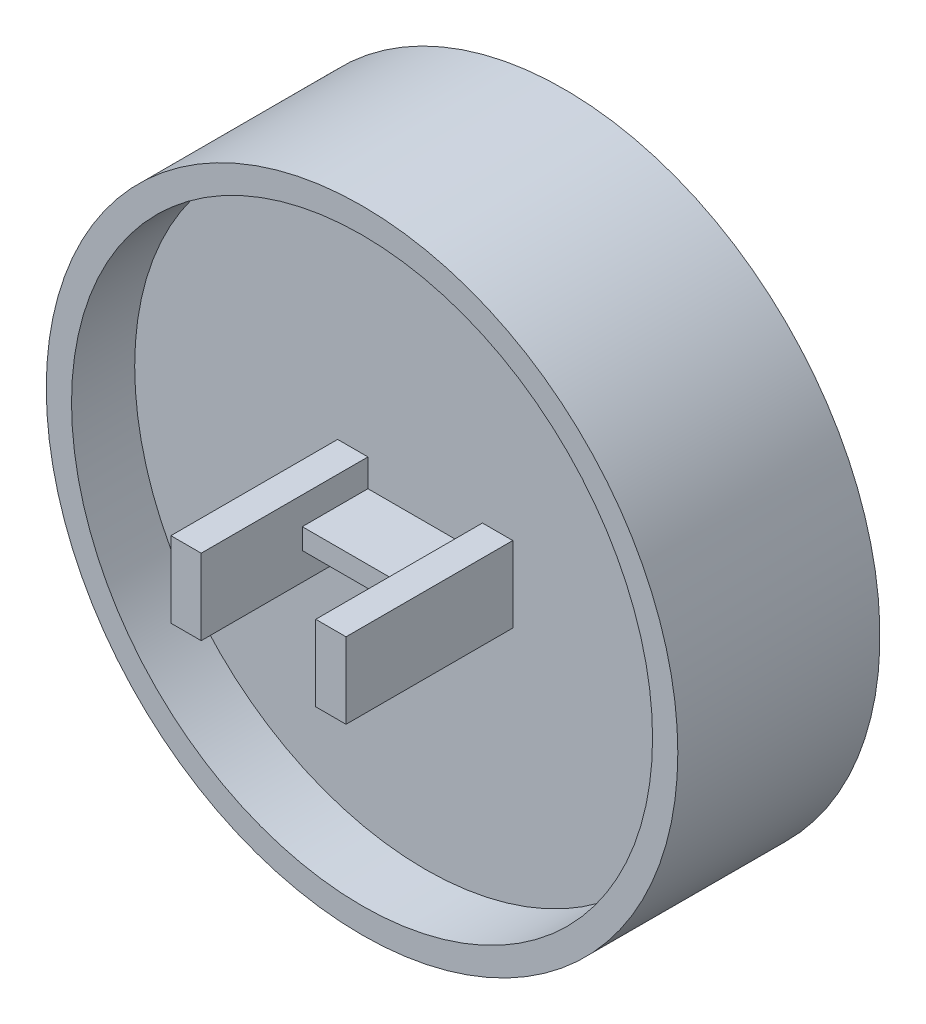
ISO-10303-21;
HEADER;
FILE_DESCRIPTION(('STEP AP214'),'2;1');
FILE_NAME('part.step','',(''),(''),'','','');
FILE_SCHEMA(('AUTOMOTIVE_DESIGN { 1 0 10303 214 1 1 1 1 }'));
ENDSEC;
DATA;
#1=APPLICATION_CONTEXT('core data for automotive mechanical design processes');
#2=APPLICATION_PROTOCOL_DEFINITION('international standard','automotive_design',2000,#1);
#3=PRODUCT_CONTEXT('',#1,'mechanical');
#4=PRODUCT('Part','Part','',(#3));
#5=PRODUCT_RELATED_PRODUCT_CATEGORY('part','',(#4));
#6=PRODUCT_DEFINITION_FORMATION('','',#4);
#7=PRODUCT_DEFINITION_CONTEXT('part definition',#1,'design');
#8=PRODUCT_DEFINITION('design','',#6,#7);
#9=PRODUCT_DEFINITION_SHAPE('','',#8);
#10=(LENGTH_UNIT() NAMED_UNIT(*) SI_UNIT(.MILLI.,.METRE.));
#11=(NAMED_UNIT(*) PLANE_ANGLE_UNIT() SI_UNIT($,.RADIAN.));
#12=(NAMED_UNIT(*) SI_UNIT($,.STERADIAN.) SOLID_ANGLE_UNIT());
#13=UNCERTAINTY_MEASURE_WITH_UNIT(LENGTH_MEASURE(1.E-05),#10,'distance_accuracy_value','');
#14=(GEOMETRIC_REPRESENTATION_CONTEXT(3) GLOBAL_UNCERTAINTY_ASSIGNED_CONTEXT((#13)) GLOBAL_UNIT_ASSIGNED_CONTEXT((#10,
#11,#12)) REPRESENTATION_CONTEXT('',''));
#15=CARTESIAN_POINT('',(0.,0.,0.));
#16=DIRECTION('',(0.,0.,1.));
#17=DIRECTION('',(1.,0.,0.));
#18=AXIS2_PLACEMENT_3D('',#15,#16,#17);
#19=CARTESIAN_POINT('',(0.,0.,5.1));
#20=DIRECTION('',(0.,0.,-1.));
#21=DIRECTION('',(-1.,0.,0.));
#22=AXIS2_PLACEMENT_3D('',#19,#20,#21);
#23=PLANE('',#22);
#24=DIRECTION('',(0.,-1.,0.));
#25=VECTOR('',#24,1.);
#26=CARTESIAN_POINT('',(2.2665,1.50603443882752,5.1));
#27=LINE('',#26,#25);
#28=CARTESIAN_POINT('',(2.2665,0.415113024771375,5.1));
#29=VERTEX_POINT('',#28);
#30=CARTESIAN_POINT('',(2.2665,-0.403044147116343,5.1));
#31=VERTEX_POINT('',#30);
#32=EDGE_CURVE('E160',#29,#31,#27,.T.);
#33=ORIENTED_EDGE('',*,*,#32,.F.);
#34=DIRECTION('',(-1.,0.,0.));
#35=VECTOR('',#34,1.);
#36=CARTESIAN_POINT('',(-2.2665,0.415113024771375,5.1));
#37=LINE('',#36,#35);
#38=CARTESIAN_POINT('',(-2.2665,0.415113024771375,5.1));
#39=VERTEX_POINT('',#38);
#40=EDGE_CURVE('E65',#29,#39,#37,.T.);
#41=ORIENTED_EDGE('',*,*,#40,.T.);
#42=DIRECTION('',(0.,1.,0.));
#43=VECTOR('',#42,1.);
#44=CARTESIAN_POINT('',(-2.2665,1.50603443882752,5.1));
#45=LINE('',#44,#43);
#46=CARTESIAN_POINT('',(-2.2665,-0.403044147116343,5.1));
#47=VERTEX_POINT('',#46);
#48=EDGE_CURVE('E11',#47,#39,#45,.T.);
#49=ORIENTED_EDGE('',*,*,#48,.F.);
#50=DIRECTION('',(1.,0.,0.));
#51=VECTOR('',#50,1.);
#52=CARTESIAN_POINT('',(-2.2665,-0.403044147116343,5.1));
#53=LINE('',#52,#51);
#54=EDGE_CURVE('E181',#47,#31,#53,.T.);
#55=ORIENTED_EDGE('',*,*,#54,.T.);
#56=EDGE_LOOP('',(#33,#41,#49,#55));
#57=FACE_BOUND('',#56,.T.);
#58=ADVANCED_FACE('F40',(#57),#23,.F.);
#59=CARTESIAN_POINT('',(0.,0.,2.5));
#60=DIRECTION('',(0.,0.,1.));
#61=DIRECTION('',(1.,0.,0.));
#62=AXIS2_PLACEMENT_3D('',#59,#60,#61);
#63=PLANE('',#62);
#64=CARTESIAN_POINT('',(0.,0.,2.5));
#65=DIRECTION('',(0.,0.,1.));
#66=DIRECTION('',(1.,0.,0.));
#67=AXIS2_PLACEMENT_3D('',#64,#65,#66);
#68=CIRCLE('',#67,11.5);
#69=CARTESIAN_POINT('',(11.5,0.,2.5));
#70=VERTEX_POINT('',#69);
#71=EDGE_CURVE('E232',#70,#70,#68,.T.);
#72=ORIENTED_EDGE('',*,*,#71,.T.);
#73=EDGE_LOOP('',(#72));
#74=FACE_BOUND('',#73,.T.);
#75=DIRECTION('',(0.,1.,0.));
#76=VECTOR('',#75,1.);
#77=CARTESIAN_POINT('',(-2.2665,-0.403044147116343,2.5));
#78=LINE('',#77,#76);
#79=CARTESIAN_POINT('',(-2.2665,-1.49396556117248,2.5));
#80=VERTEX_POINT('',#79);
#81=CARTESIAN_POINT('',(-2.2665,-0.403044147116343,2.5));
#82=VERTEX_POINT('',#81);
#83=EDGE_CURVE('E187',#80,#82,#78,.T.);
#84=ORIENTED_EDGE('',*,*,#83,.F.);
#85=DIRECTION('',(1.,0.,0.));
#86=VECTOR('',#85,1.);
#87=CARTESIAN_POINT('',(-3.4665,-1.49396556117248,2.5));
#88=LINE('',#87,#86);
#89=CARTESIAN_POINT('',(-3.4665,-1.49396556117248,2.5));
#90=VERTEX_POINT('',#89);
#91=EDGE_CURVE('E179',#90,#80,#88,.T.);
#92=ORIENTED_EDGE('',*,*,#91,.F.);
#93=DIRECTION('',(0.,-1.,0.));
#94=VECTOR('',#93,1.);
#95=CARTESIAN_POINT('',(-3.4665,1.50603443882752,2.5));
#96=LINE('',#95,#94);
#97=CARTESIAN_POINT('',(-3.4665,1.50603443882752,2.5));
#98=VERTEX_POINT('',#97);
#99=EDGE_CURVE('E105',#98,#90,#96,.T.);
#100=ORIENTED_EDGE('',*,*,#99,.F.);
#101=DIRECTION('',(-1.,0.,0.));
#102=VECTOR('',#101,1.);
#103=CARTESIAN_POINT('',(-3.4665,1.50603443882752,2.5));
#104=LINE('',#103,#102);
#105=CARTESIAN_POINT('',(-2.2665,1.50603443882752,2.5));
#106=VERTEX_POINT('',#105);
#107=EDGE_CURVE('E204',#106,#98,#104,.T.);
#108=ORIENTED_EDGE('',*,*,#107,.F.);
#109=DIRECTION('',(0.,1.,0.));
#110=VECTOR('',#109,1.);
#111=CARTESIAN_POINT('',(-2.2665,1.50603443882752,2.5));
#112=LINE('',#111,#110);
#113=CARTESIAN_POINT('',(-2.2665,0.415113024771375,2.5));
#114=VERTEX_POINT('',#113);
#115=EDGE_CURVE('E202',#114,#106,#112,.T.);
#116=ORIENTED_EDGE('',*,*,#115,.F.);
#117=DIRECTION('',(-1.,0.,0.));
#118=VECTOR('',#117,1.);
#119=CARTESIAN_POINT('',(-2.2665,0.415113024771375,2.5));
#120=LINE('',#119,#118);
#121=CARTESIAN_POINT('',(2.2665,0.415113024771375,2.5));
#122=VERTEX_POINT('',#121);
#123=EDGE_CURVE('E200',#122,#114,#120,.T.);
#124=ORIENTED_EDGE('',*,*,#123,.F.);
#125=DIRECTION('',(0.,-1.,0.));
#126=VECTOR('',#125,1.);
#127=CARTESIAN_POINT('',(2.2665,0.415113024771375,2.5));
#128=LINE('',#127,#126);
#129=CARTESIAN_POINT('',(2.2665,1.50603443882752,2.5));
#130=VERTEX_POINT('',#129);
#131=EDGE_CURVE('E198',#130,#122,#128,.T.);
#132=ORIENTED_EDGE('',*,*,#131,.F.);
#133=DIRECTION('',(-1.,0.,0.));
#134=VECTOR('',#133,1.);
#135=CARTESIAN_POINT('',(3.4665,1.50603443882752,2.5));
#136=LINE('',#135,#134);
#137=CARTESIAN_POINT('',(3.4665,1.50603443882752,2.5));
#138=VERTEX_POINT('',#137);
#139=EDGE_CURVE('E196',#138,#130,#136,.T.);
#140=ORIENTED_EDGE('',*,*,#139,.F.);
#141=DIRECTION('',(0.,1.,0.));
#142=VECTOR('',#141,1.);
#143=CARTESIAN_POINT('',(3.4665,1.50603443882752,2.5));
#144=LINE('',#143,#142);
#145=CARTESIAN_POINT('',(3.4665,-1.49396556117248,2.5));
#146=VERTEX_POINT('',#145);
#147=EDGE_CURVE('E140',#146,#138,#144,.T.);
#148=ORIENTED_EDGE('',*,*,#147,.F.);
#149=DIRECTION('',(1.,0.,0.));
#150=VECTOR('',#149,1.);
#151=CARTESIAN_POINT('',(3.4665,-1.49396556117248,2.5));
#152=LINE('',#151,#150);
#153=CARTESIAN_POINT('',(2.2665,-1.49396556117248,2.5));
#154=VERTEX_POINT('',#153);
#155=EDGE_CURVE('E193',#154,#146,#152,.T.);
#156=ORIENTED_EDGE('',*,*,#155,.F.);
#157=DIRECTION('',(0.,-1.,0.));
#158=VECTOR('',#157,1.);
#159=CARTESIAN_POINT('',(2.2665,-0.403044147116343,2.5));
#160=LINE('',#159,#158);
#161=CARTESIAN_POINT('',(2.2665,-0.403044147116343,2.5));
#162=VERTEX_POINT('',#161);
#163=EDGE_CURVE('E191',#162,#154,#160,.T.);
#164=ORIENTED_EDGE('',*,*,#163,.F.);
#165=DIRECTION('',(1.,0.,0.));
#166=VECTOR('',#165,1.);
#167=CARTESIAN_POINT('',(-2.2665,-0.403044147116343,2.5));
#168=LINE('',#167,#166);
#169=EDGE_CURVE('E189',#82,#162,#168,.T.);
#170=ORIENTED_EDGE('',*,*,#169,.F.);
#171=EDGE_LOOP('',(#84,#92,#100,#108,#116,#124,#132,#140,#148,#156,#164,#170));
#172=FACE_BOUND('',#171,.T.);
#173=ADVANCED_FACE('F247',(#74,#172),#63,.T.);
#174=CARTESIAN_POINT('',(0.,0.,5.));
#175=DIRECTION('',(0.,0.,-1.));
#176=DIRECTION('',(-1.,0.,0.));
#177=AXIS2_PLACEMENT_3D('',#174,#175,#176);
#178=CYLINDRICAL_SURFACE('',#177,12.5);
#179=CARTESIAN_POINT('',(0.,0.,5.));
#180=DIRECTION('',(0.,0.,1.));
#181=DIRECTION('',(1.,0.,0.));
#182=AXIS2_PLACEMENT_3D('',#179,#180,#181);
#183=CIRCLE('',#182,12.5);
#184=CARTESIAN_POINT('',(12.5,0.,5.));
#185=VERTEX_POINT('',#184);
#186=EDGE_CURVE('E44',#185,#185,#183,.T.);
#187=ORIENTED_EDGE('',*,*,#186,.F.);
#188=EDGE_LOOP('',(#187));
#189=FACE_BOUND('',#188,.T.);
#190=CARTESIAN_POINT('',(0.,0.,-3.));
#191=DIRECTION('',(0.,0.,-1.));
#192=DIRECTION('',(-1.,0.,0.));
#193=AXIS2_PLACEMENT_3D('',#190,#191,#192);
#194=CIRCLE('',#193,12.5);
#195=CARTESIAN_POINT('',(-12.5,0.,-3.));
#196=VERTEX_POINT('',#195);
#197=EDGE_CURVE('E155',#196,#196,#194,.T.);
#198=ORIENTED_EDGE('',*,*,#197,.F.);
#199=EDGE_LOOP('',(#198));
#200=FACE_BOUND('',#199,.T.);
#201=ADVANCED_FACE('F42',(#189,#200),#178,.T.);
#202=CARTESIAN_POINT('',(0.,0.,5.));
#203=DIRECTION('',(0.,0.,1.));
#204=DIRECTION('',(1.,0.,0.));
#205=AXIS2_PLACEMENT_3D('',#202,#203,#204);
#206=PLANE('',#205);
#207=CARTESIAN_POINT('',(0.,0.,5.));
#208=DIRECTION('',(0.,0.,1.));
#209=DIRECTION('',(1.,0.,0.));
#210=AXIS2_PLACEMENT_3D('',#207,#208,#209);
#211=CIRCLE('',#210,11.5);
#212=CARTESIAN_POINT('',(11.5,0.,5.));
#213=VERTEX_POINT('',#212);
#214=EDGE_CURVE('E231',#213,#213,#211,.T.);
#215=ORIENTED_EDGE('',*,*,#214,.F.);
#216=EDGE_LOOP('',(#215));
#217=FACE_BOUND('',#216,.T.);
#218=ORIENTED_EDGE('',*,*,#186,.T.);
#219=EDGE_LOOP('',(#218));
#220=FACE_BOUND('',#219,.T.);
#221=ADVANCED_FACE('F239',(#217,#220),#206,.T.);
#222=CARTESIAN_POINT('',(0.,0.,2.5));
#223=DIRECTION('',(0.,0.,1.));
#224=DIRECTION('',(1.,0.,0.));
#225=AXIS2_PLACEMENT_3D('',#222,#223,#224);
#226=CYLINDRICAL_SURFACE('',#225,11.5);
#227=ORIENTED_EDGE('',*,*,#71,.F.);
#228=EDGE_LOOP('',(#227));
#229=FACE_BOUND('',#228,.T.);
#230=ORIENTED_EDGE('',*,*,#214,.T.);
#231=EDGE_LOOP('',(#230));
#232=FACE_BOUND('',#231,.T.);
#233=ADVANCED_FACE('F237',(#229,#232),#226,.F.);
#234=CARTESIAN_POINT('',(-3.4665,-1.49396556117248,5.1));
#235=DIRECTION('',(0.,1.,0.));
#236=DIRECTION('',(0.,0.,1.));
#237=AXIS2_PLACEMENT_3D('',#234,#235,#236);
#238=PLANE('',#237);
#239=ORIENTED_EDGE('',*,*,#91,.T.);
#240=DIRECTION('',(0.,0.,-1.));
#241=VECTOR('',#240,1.);
#242=CARTESIAN_POINT('',(-2.2665,-1.49396556117248,5.1));
#243=LINE('',#242,#241);
#244=CARTESIAN_POINT('',(-2.2665,-1.49396556117248,9.1));
#245=VERTEX_POINT('',#244);
#246=EDGE_CURVE('E229',#245,#80,#243,.T.);
#247=ORIENTED_EDGE('',*,*,#246,.F.);
#248=DIRECTION('',(1.,0.,0.));
#249=VECTOR('',#248,1.);
#250=CARTESIAN_POINT('',(-2.2665,-1.49396556117248,9.1));
#251=LINE('',#250,#249);
#252=CARTESIAN_POINT('',(-3.4665,-1.49396556117248,9.1));
#253=VERTEX_POINT('',#252);
#254=EDGE_CURVE('E174',#253,#245,#251,.T.);
#255=ORIENTED_EDGE('',*,*,#254,.F.);
#256=DIRECTION('',(0.,0.,-1.));
#257=VECTOR('',#256,1.);
#258=CARTESIAN_POINT('',(-3.4665,-1.49396556117248,5.1));
#259=LINE('',#258,#257);
#260=EDGE_CURVE('E184',#253,#90,#259,.T.);
#261=ORIENTED_EDGE('',*,*,#260,.T.);
#262=EDGE_LOOP('',(#239,#247,#255,#261));
#263=FACE_BOUND('',#262,.T.);
#264=ADVANCED_FACE('F299',(#263),#238,.F.);
#265=CARTESIAN_POINT('',(-2.2665,-0.403044147116343,5.1));
#266=DIRECTION('',(-1.,0.,0.));
#267=DIRECTION('',(0.,0.,1.));
#268=AXIS2_PLACEMENT_3D('',#265,#266,#267);
#269=PLANE('',#268);
#270=ORIENTED_EDGE('',*,*,#83,.T.);
#271=DIRECTION('',(0.,0.,-1.));
#272=VECTOR('',#271,1.);
#273=CARTESIAN_POINT('',(-2.2665,-0.403044147116343,5.1));
#274=LINE('',#273,#272);
#275=EDGE_CURVE('E226',#47,#82,#274,.T.);
#276=ORIENTED_EDGE('',*,*,#275,.F.);
#277=ORIENTED_EDGE('',*,*,#48,.T.);
#278=DIRECTION('',(0.,0.,-1.));
#279=VECTOR('',#278,1.);
#280=CARTESIAN_POINT('',(-2.2665,0.415113024771375,5.1));
#281=LINE('',#280,#279);
#282=EDGE_CURVE('E212',#39,#114,#281,.T.);
#283=ORIENTED_EDGE('',*,*,#282,.T.);
#284=ORIENTED_EDGE('',*,*,#115,.T.);
#285=DIRECTION('',(0.,0.,-1.));
#286=VECTOR('',#285,1.);
#287=CARTESIAN_POINT('',(-2.2665,1.50603443882752,5.1));
#288=LINE('',#287,#286);
#289=CARTESIAN_POINT('',(-2.2665,1.50603443882752,9.1));
#290=VERTEX_POINT('',#289);
#291=EDGE_CURVE('E209',#290,#106,#288,.T.);
#292=ORIENTED_EDGE('',*,*,#291,.F.);
#293=DIRECTION('',(0.,1.,0.));
#294=VECTOR('',#293,1.);
#295=CARTESIAN_POINT('',(-2.2665,1.50603443882752,9.1));
#296=LINE('',#295,#294);
#297=EDGE_CURVE('E177',#245,#290,#296,.T.);
#298=ORIENTED_EDGE('',*,*,#297,.F.);
#299=ORIENTED_EDGE('',*,*,#246,.T.);
#300=EDGE_LOOP('',(#270,#276,#277,#283,#284,#292,#298,#299));
#301=FACE_BOUND('',#300,.T.);
#302=ADVANCED_FACE('F295',(#301),#269,.F.);
#303=CARTESIAN_POINT('',(-2.2665,-0.403044147116343,5.1));
#304=DIRECTION('',(0.,1.,0.));
#305=DIRECTION('',(0.,0.,1.));
#306=AXIS2_PLACEMENT_3D('',#303,#304,#305);
#307=PLANE('',#306);
#308=ORIENTED_EDGE('',*,*,#169,.T.);
#309=DIRECTION('',(0.,0.,-1.));
#310=VECTOR('',#309,1.);
#311=CARTESIAN_POINT('',(2.2665,-0.403044147116343,5.1));
#312=LINE('',#311,#310);
#313=EDGE_CURVE('E223',#31,#162,#312,.T.);
#314=ORIENTED_EDGE('',*,*,#313,.F.);
#315=ORIENTED_EDGE('',*,*,#54,.F.);
#316=ORIENTED_EDGE('',*,*,#275,.T.);
#317=EDGE_LOOP('',(#308,#314,#315,#316));
#318=FACE_BOUND('',#317,.T.);
#319=ADVANCED_FACE('F291',(#318),#307,.F.);
#320=CARTESIAN_POINT('',(2.2665,-0.403044147116343,5.1));
#321=DIRECTION('',(1.,0.,0.));
#322=DIRECTION('',(0.,0.,-1.));
#323=AXIS2_PLACEMENT_3D('',#320,#321,#322);
#324=PLANE('',#323);
#325=ORIENTED_EDGE('',*,*,#163,.T.);
#326=DIRECTION('',(0.,0.,-1.));
#327=VECTOR('',#326,1.);
#328=CARTESIAN_POINT('',(2.2665,-1.49396556117248,5.1));
#329=LINE('',#328,#327);
#330=CARTESIAN_POINT('',(2.2665,-1.49396556117248,9.1));
#331=VERTEX_POINT('',#330);
#332=EDGE_CURVE('E220',#331,#154,#329,.T.);
#333=ORIENTED_EDGE('',*,*,#332,.F.);
#334=DIRECTION('',(0.,-1.,0.));
#335=VECTOR('',#334,1.);
#336=CARTESIAN_POINT('',(2.2665,1.50603443882752,9.1));
#337=LINE('',#336,#335);
#338=CARTESIAN_POINT('',(2.2665,1.50603443882752,9.1));
#339=VERTEX_POINT('',#338);
#340=EDGE_CURVE('E161',#339,#331,#337,.T.);
#341=ORIENTED_EDGE('',*,*,#340,.F.);
#342=DIRECTION('',(0.,0.,-1.));
#343=VECTOR('',#342,1.);
#344=CARTESIAN_POINT('',(2.2665,1.50603443882752,5.1));
#345=LINE('',#344,#343);
#346=EDGE_CURVE('E145',#339,#130,#345,.T.);
#347=ORIENTED_EDGE('',*,*,#346,.T.);
#348=ORIENTED_EDGE('',*,*,#131,.T.);
#349=DIRECTION('',(0.,0.,-1.));
#350=VECTOR('',#349,1.);
#351=CARTESIAN_POINT('',(2.2665,0.415113024771375,5.1));
#352=LINE('',#351,#350);
#353=EDGE_CURVE('E215',#29,#122,#352,.T.);
#354=ORIENTED_EDGE('',*,*,#353,.F.);
#355=ORIENTED_EDGE('',*,*,#32,.T.);
#356=ORIENTED_EDGE('',*,*,#313,.T.);
#357=EDGE_LOOP('',(#325,#333,#341,#347,#348,#354,#355,#356));
#358=FACE_BOUND('',#357,.T.);
#359=ADVANCED_FACE('F287',(#358),#324,.F.);
#360=CARTESIAN_POINT('',(3.4665,-1.49396556117248,5.1));
#361=DIRECTION('',(0.,1.,0.));
#362=DIRECTION('',(-1.,0.,0.));
#363=AXIS2_PLACEMENT_3D('',#360,#361,#362);
#364=PLANE('',#363);
#365=ORIENTED_EDGE('',*,*,#155,.T.);
#366=DIRECTION('',(0.,0.,-1.));
#367=VECTOR('',#366,1.);
#368=CARTESIAN_POINT('',(3.4665,-1.49396556117248,5.1));
#369=LINE('',#368,#367);
#370=CARTESIAN_POINT('',(3.4665,-1.49396556117248,9.1));
#371=VERTEX_POINT('',#370);
#372=EDGE_CURVE('E144',#371,#146,#369,.T.);
#373=ORIENTED_EDGE('',*,*,#372,.F.);
#374=DIRECTION('',(1.,0.,0.));
#375=VECTOR('',#374,1.);
#376=CARTESIAN_POINT('',(2.2665,-1.49396556117248,9.1));
#377=LINE('',#376,#375);
#378=EDGE_CURVE('E154',#331,#371,#377,.T.);
#379=ORIENTED_EDGE('',*,*,#378,.F.);
#380=ORIENTED_EDGE('',*,*,#332,.T.);
#381=EDGE_LOOP('',(#365,#373,#379,#380));
#382=FACE_BOUND('',#381,.T.);
#383=ADVANCED_FACE('F284',(#382),#364,.F.);
#384=CARTESIAN_POINT('',(3.4665,1.50603443882752,5.1));
#385=DIRECTION('',(-1.,0.,0.));
#386=DIRECTION('',(0.,-1.,0.));
#387=AXIS2_PLACEMENT_3D('',#384,#385,#386);
#388=PLANE('',#387);
#389=ORIENTED_EDGE('',*,*,#147,.T.);
#390=DIRECTION('',(0.,0.,-1.));
#391=VECTOR('',#390,1.);
#392=CARTESIAN_POINT('',(3.4665,1.50603443882752,5.1));
#393=LINE('',#392,#391);
#394=CARTESIAN_POINT('',(3.4665,1.50603443882752,9.1));
#395=VERTEX_POINT('',#394);
#396=EDGE_CURVE('E134',#395,#138,#393,.T.);
#397=ORIENTED_EDGE('',*,*,#396,.F.);
#398=DIRECTION('',(0.,1.,0.));
#399=VECTOR('',#398,1.);
#400=CARTESIAN_POINT('',(3.4665,-1.49396556117248,9.1));
#401=LINE('',#400,#399);
#402=EDGE_CURVE('E138',#371,#395,#401,.T.);
#403=ORIENTED_EDGE('',*,*,#402,.F.);
#404=ORIENTED_EDGE('',*,*,#372,.T.);
#405=EDGE_LOOP('',(#389,#397,#403,#404));
#406=FACE_BOUND('',#405,.T.);
#407=ADVANCED_FACE('F136',(#406),#388,.F.);
#408=CARTESIAN_POINT('',(3.4665,1.50603443882752,5.1));
#409=DIRECTION('',(0.,-1.,0.));
#410=DIRECTION('',(1.,0.,0.));
#411=AXIS2_PLACEMENT_3D('',#408,#409,#410);
#412=PLANE('',#411);
#413=ORIENTED_EDGE('',*,*,#139,.T.);
#414=ORIENTED_EDGE('',*,*,#346,.F.);
#415=DIRECTION('',(-1.,0.,0.));
#416=VECTOR('',#415,1.);
#417=CARTESIAN_POINT('',(3.4665,1.50603443882752,9.1));
#418=LINE('',#417,#416);
#419=EDGE_CURVE('E152',#395,#339,#418,.T.);
#420=ORIENTED_EDGE('',*,*,#419,.F.);
#421=ORIENTED_EDGE('',*,*,#396,.T.);
#422=EDGE_LOOP('',(#413,#414,#420,#421));
#423=FACE_BOUND('',#422,.T.);
#424=ADVANCED_FACE('F157',(#423),#412,.F.);
#425=CARTESIAN_POINT('',(-2.2665,0.415113024771375,5.1));
#426=DIRECTION('',(0.,-1.,0.));
#427=DIRECTION('',(0.,0.,-1.));
#428=AXIS2_PLACEMENT_3D('',#425,#426,#427);
#429=PLANE('',#428);
#430=ORIENTED_EDGE('',*,*,#123,.T.);
#431=ORIENTED_EDGE('',*,*,#282,.F.);
#432=ORIENTED_EDGE('',*,*,#40,.F.);
#433=ORIENTED_EDGE('',*,*,#353,.T.);
#434=EDGE_LOOP('',(#430,#431,#432,#433));
#435=FACE_BOUND('',#434,.T.);
#436=ADVANCED_FACE('F275',(#435),#429,.F.);
#437=CARTESIAN_POINT('',(-3.4665,1.50603443882752,5.1));
#438=DIRECTION('',(0.,-1.,0.));
#439=DIRECTION('',(0.,0.,-1.));
#440=AXIS2_PLACEMENT_3D('',#437,#438,#439);
#441=PLANE('',#440);
#442=ORIENTED_EDGE('',*,*,#107,.T.);
#443=DIRECTION('',(0.,0.,-1.));
#444=VECTOR('',#443,1.);
#445=CARTESIAN_POINT('',(-3.4665,1.50603443882752,5.1));
#446=LINE('',#445,#444);
#447=CARTESIAN_POINT('',(-3.4665,1.50603443882752,9.1));
#448=VERTEX_POINT('',#447);
#449=EDGE_CURVE('E56',#448,#98,#446,.T.);
#450=ORIENTED_EDGE('',*,*,#449,.F.);
#451=DIRECTION('',(-1.,0.,0.));
#452=VECTOR('',#451,1.);
#453=CARTESIAN_POINT('',(-3.4665,1.50603443882752,9.1));
#454=LINE('',#453,#452);
#455=EDGE_CURVE('E164',#290,#448,#454,.T.);
#456=ORIENTED_EDGE('',*,*,#455,.F.);
#457=ORIENTED_EDGE('',*,*,#291,.T.);
#458=EDGE_LOOP('',(#442,#450,#456,#457));
#459=FACE_BOUND('',#458,.T.);
#460=ADVANCED_FACE('F272',(#459),#441,.F.);
#461=CARTESIAN_POINT('',(-3.4665,1.50603443882752,5.1));
#462=DIRECTION('',(1.,0.,0.));
#463=DIRECTION('',(0.,0.,-1.));
#464=AXIS2_PLACEMENT_3D('',#461,#462,#463);
#465=PLANE('',#464);
#466=ORIENTED_EDGE('',*,*,#99,.T.);
#467=ORIENTED_EDGE('',*,*,#260,.F.);
#468=DIRECTION('',(0.,-1.,0.));
#469=VECTOR('',#468,1.);
#470=CARTESIAN_POINT('',(-3.4665,-1.49396556117248,9.1));
#471=LINE('',#470,#469);
#472=EDGE_CURVE('E171',#448,#253,#471,.T.);
#473=ORIENTED_EDGE('',*,*,#472,.F.);
#474=ORIENTED_EDGE('',*,*,#449,.T.);
#475=EDGE_LOOP('',(#466,#467,#473,#474));
#476=FACE_BOUND('',#475,.T.);
#477=ADVANCED_FACE('F269',(#476),#465,.F.);
#478=CARTESIAN_POINT('',(0.,0.,9.1));
#479=DIRECTION('',(0.,0.,-1.));
#480=DIRECTION('',(-1.,0.,0.));
#481=AXIS2_PLACEMENT_3D('',#478,#479,#480);
#482=PLANE('',#481);
#483=ORIENTED_EDGE('',*,*,#455,.T.);
#484=ORIENTED_EDGE('',*,*,#472,.T.);
#485=ORIENTED_EDGE('',*,*,#254,.T.);
#486=ORIENTED_EDGE('',*,*,#297,.T.);
#487=EDGE_LOOP('',(#483,#484,#485,#486));
#488=FACE_BOUND('',#487,.T.);
#489=ADVANCED_FACE('F258',(#488),#482,.F.);
#490=CARTESIAN_POINT('',(0.,0.,9.1));
#491=DIRECTION('',(0.,0.,1.));
#492=DIRECTION('',(1.,0.,0.));
#493=AXIS2_PLACEMENT_3D('',#490,#491,#492);
#494=PLANE('',#493);
#495=ORIENTED_EDGE('',*,*,#419,.T.);
#496=ORIENTED_EDGE('',*,*,#340,.T.);
#497=ORIENTED_EDGE('',*,*,#378,.T.);
#498=ORIENTED_EDGE('',*,*,#402,.T.);
#499=EDGE_LOOP('',(#495,#496,#497,#498));
#500=FACE_BOUND('',#499,.T.);
#501=ADVANCED_FACE('F150',(#500),#494,.T.);
#502=CARTESIAN_POINT('',(0.,0.,-3.));
#503=DIRECTION('',(0.,0.,-1.));
#504=DIRECTION('',(-1.,0.,0.));
#505=AXIS2_PLACEMENT_3D('',#502,#503,#504);
#506=PLANE('',#505);
#507=ORIENTED_EDGE('',*,*,#197,.T.);
#508=EDGE_LOOP('',(#507));
#509=FACE_BOUND('',#508,.T.);
#510=ADVANCED_FACE('F252',(#509),#506,.T.);
#511=CLOSED_SHELL('',(#58,#173,#201,#221,#233,#264,#302,#319,#359,#383,#407,#424,#436,#460,#477,
#489,#501,#510));
#512=MANIFOLD_SOLID_BREP('B2',#511);
#513=ADVANCED_BREP_SHAPE_REPRESENTATION('',(#18,#512),#14);
#514=SHAPE_DEFINITION_REPRESENTATION(#9,#513);
ENDSEC;
END-ISO-10303-21;
